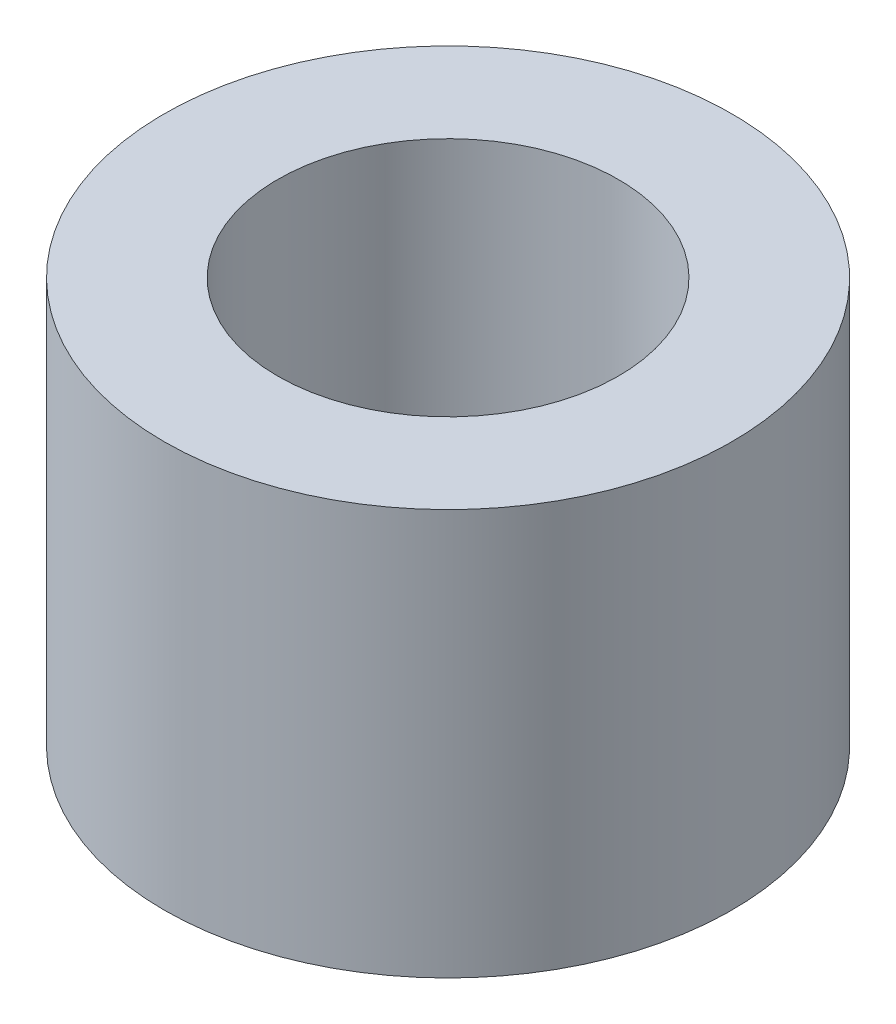
ISO-10303-21;
HEADER;
FILE_DESCRIPTION(('STEP AP214'),'2;1');
FILE_NAME('part.step','',(''),(''),'','','');
FILE_SCHEMA(('AUTOMOTIVE_DESIGN { 1 0 10303 214 1 1 1 1 }'));
ENDSEC;
DATA;
#1=APPLICATION_CONTEXT('core data for automotive mechanical design processes');
#2=APPLICATION_PROTOCOL_DEFINITION('international standard','automotive_design',2000,#1);
#3=PRODUCT_CONTEXT('',#1,'mechanical');
#4=PRODUCT('Part','Part','',(#3));
#5=PRODUCT_RELATED_PRODUCT_CATEGORY('part','',(#4));
#6=PRODUCT_DEFINITION_FORMATION('','',#4);
#7=PRODUCT_DEFINITION_CONTEXT('part definition',#1,'design');
#8=PRODUCT_DEFINITION('design','',#6,#7);
#9=PRODUCT_DEFINITION_SHAPE('','',#8);
#10=(LENGTH_UNIT() NAMED_UNIT(*) SI_UNIT(.MILLI.,.METRE.));
#11=(NAMED_UNIT(*) PLANE_ANGLE_UNIT() SI_UNIT($,.RADIAN.));
#12=(NAMED_UNIT(*) SI_UNIT($,.STERADIAN.) SOLID_ANGLE_UNIT());
#13=UNCERTAINTY_MEASURE_WITH_UNIT(LENGTH_MEASURE(1.E-05),#10,'distance_accuracy_value','');
#14=(GEOMETRIC_REPRESENTATION_CONTEXT(3) GLOBAL_UNCERTAINTY_ASSIGNED_CONTEXT((#13)) GLOBAL_UNIT_ASSIGNED_CONTEXT((#10,
#11,#12)) REPRESENTATION_CONTEXT('',''));
#15=CARTESIAN_POINT('',(0.,0.,0.));
#16=DIRECTION('',(0.,0.,1.));
#17=DIRECTION('',(1.,0.,0.));
#18=AXIS2_PLACEMENT_3D('',#15,#16,#17);
#19=CARTESIAN_POINT('',(0.,5.,0.));
#20=DIRECTION('',(0.,1.,0.));
#21=DIRECTION('',(0.,0.,1.));
#22=AXIS2_PLACEMENT_3D('',#19,#20,#21);
#23=PLANE('',#22);
#24=CARTESIAN_POINT('',(0.,5.,0.));
#25=DIRECTION('',(0.,1.,0.));
#26=DIRECTION('',(0.,0.,1.));
#27=AXIS2_PLACEMENT_3D('',#24,#25,#26);
#28=CIRCLE('',#27,3.5);
#29=CARTESIAN_POINT('',(0.,5.,3.5));
#30=VERTEX_POINT('',#29);
#31=EDGE_CURVE('E10',#30,#30,#28,.T.);
#32=ORIENTED_EDGE('',*,*,#31,.T.);
#33=EDGE_LOOP('',(#32));
#34=FACE_BOUND('',#33,.T.);
#35=CARTESIAN_POINT('',(0.,5.,0.));
#36=DIRECTION('',(0.,1.,0.));
#37=DIRECTION('',(0.,0.,1.));
#38=AXIS2_PLACEMENT_3D('',#35,#36,#37);
#39=CIRCLE('',#38,2.1);
#40=CARTESIAN_POINT('',(0.,5.,2.1));
#41=VERTEX_POINT('',#40);
#42=EDGE_CURVE('E42',#41,#41,#39,.T.);
#43=ORIENTED_EDGE('',*,*,#42,.F.);
#44=EDGE_LOOP('',(#43));
#45=FACE_BOUND('',#44,.T.);
#46=ADVANCED_FACE('F31',(#34,#45),#23,.T.);
#47=CARTESIAN_POINT('',(0.,0.,0.));
#48=DIRECTION('',(0.,1.,0.));
#49=DIRECTION('',(0.,0.,1.));
#50=AXIS2_PLACEMENT_3D('',#47,#48,#49);
#51=PLANE('',#50);
#52=CARTESIAN_POINT('',(0.,0.,0.));
#53=DIRECTION('',(0.,1.,0.));
#54=DIRECTION('',(0.,0.,1.));
#55=AXIS2_PLACEMENT_3D('',#52,#53,#54);
#56=CIRCLE('',#55,3.5);
#57=CARTESIAN_POINT('',(0.,0.,3.5));
#58=VERTEX_POINT('',#57);
#59=EDGE_CURVE('E35',#58,#58,#56,.T.);
#60=ORIENTED_EDGE('',*,*,#59,.F.);
#61=EDGE_LOOP('',(#60));
#62=FACE_BOUND('',#61,.T.);
#63=CARTESIAN_POINT('',(0.,0.,0.));
#64=DIRECTION('',(0.,1.,0.));
#65=DIRECTION('',(0.,0.,1.));
#66=AXIS2_PLACEMENT_3D('',#63,#64,#65);
#67=CIRCLE('',#66,2.1);
#68=CARTESIAN_POINT('',(0.,0.,2.1));
#69=VERTEX_POINT('',#68);
#70=EDGE_CURVE('E44',#69,#69,#67,.T.);
#71=ORIENTED_EDGE('',*,*,#70,.T.);
#72=EDGE_LOOP('',(#71));
#73=FACE_BOUND('',#72,.T.);
#74=ADVANCED_FACE('F54',(#62,#73),#51,.F.);
#75=CARTESIAN_POINT('',(0.,5.,0.));
#76=DIRECTION('',(0.,-1.,0.));
#77=DIRECTION('',(0.,0.,-1.));
#78=AXIS2_PLACEMENT_3D('',#75,#76,#77);
#79=CYLINDRICAL_SURFACE('',#78,3.5);
#80=ORIENTED_EDGE('',*,*,#31,.F.);
#81=EDGE_LOOP('',(#80));
#82=FACE_BOUND('',#81,.T.);
#83=ORIENTED_EDGE('',*,*,#59,.T.);
#84=EDGE_LOOP('',(#83));
#85=FACE_BOUND('',#84,.T.);
#86=ADVANCED_FACE('F33',(#82,#85),#79,.T.);
#87=CARTESIAN_POINT('',(0.,5.,0.));
#88=DIRECTION('',(0.,-1.,0.));
#89=DIRECTION('',(0.,0.,-1.));
#90=AXIS2_PLACEMENT_3D('',#87,#88,#89);
#91=CYLINDRICAL_SURFACE('',#90,2.1);
#92=ORIENTED_EDGE('',*,*,#42,.T.);
#93=EDGE_LOOP('',(#92));
#94=FACE_BOUND('',#93,.T.);
#95=ORIENTED_EDGE('',*,*,#70,.F.);
#96=EDGE_LOOP('',(#95));
#97=FACE_BOUND('',#96,.T.);
#98=ADVANCED_FACE('F50',(#94,#97),#91,.F.);
#99=CLOSED_SHELL('',(#46,#74,#86,#98));
#100=MANIFOLD_SOLID_BREP('B2',#99);
#101=ADVANCED_BREP_SHAPE_REPRESENTATION('',(#18,#100),#14);
#102=SHAPE_DEFINITION_REPRESENTATION(#9,#101);
ENDSEC;
END-ISO-10303-21;
